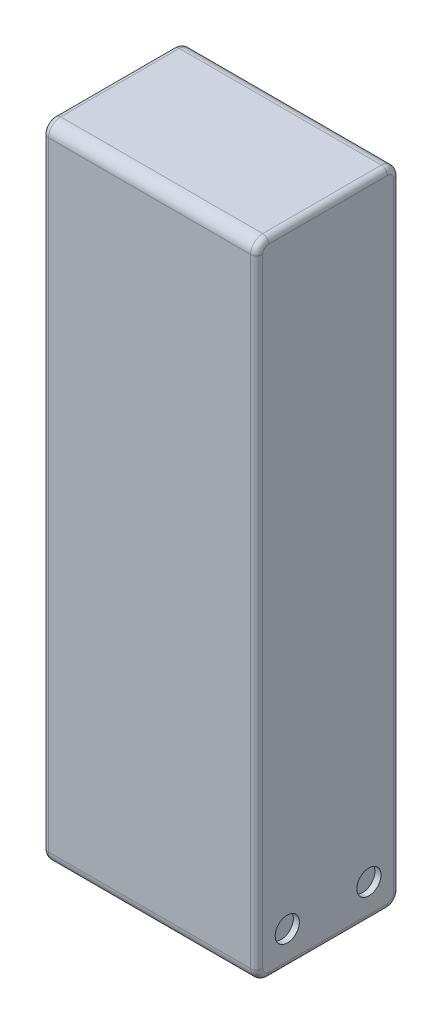
ISO-10303-21;
HEADER;
FILE_DESCRIPTION(('STEP AP214'),'2;1');
FILE_NAME('part.step','',(''),(''),'','','');
FILE_SCHEMA(('AUTOMOTIVE_DESIGN { 1 0 10303 214 1 1 1 1 }'));
ENDSEC;
DATA;
#1=APPLICATION_CONTEXT('core data for automotive mechanical design processes');
#2=APPLICATION_PROTOCOL_DEFINITION('international standard','automotive_design',2000,#1);
#3=PRODUCT_CONTEXT('',#1,'mechanical');
#4=PRODUCT('Part','Part','',(#3));
#5=PRODUCT_RELATED_PRODUCT_CATEGORY('part','',(#4));
#6=PRODUCT_DEFINITION_FORMATION('','',#4);
#7=PRODUCT_DEFINITION_CONTEXT('part definition',#1,'design');
#8=PRODUCT_DEFINITION('design','',#6,#7);
#9=PRODUCT_DEFINITION_SHAPE('','',#8);
#10=(LENGTH_UNIT() NAMED_UNIT(*) SI_UNIT(.MILLI.,.METRE.));
#11=(NAMED_UNIT(*) PLANE_ANGLE_UNIT() SI_UNIT($,.RADIAN.));
#12=(NAMED_UNIT(*) SI_UNIT($,.STERADIAN.) SOLID_ANGLE_UNIT());
#13=UNCERTAINTY_MEASURE_WITH_UNIT(LENGTH_MEASURE(1.E-05),#10,'distance_accuracy_value','');
#14=(GEOMETRIC_REPRESENTATION_CONTEXT(3) GLOBAL_UNCERTAINTY_ASSIGNED_CONTEXT((#13)) GLOBAL_UNIT_ASSIGNED_CONTEXT((#10,
#11,#12)) REPRESENTATION_CONTEXT('',''));
#15=CARTESIAN_POINT('',(0.,0.,0.));
#16=DIRECTION('',(0.,0.,1.));
#17=DIRECTION('',(1.,0.,0.));
#18=AXIS2_PLACEMENT_3D('',#15,#16,#17);
#19=CARTESIAN_POINT('',(22.5000000000002,67.5,15.));
#20=DIRECTION('',(-1.,0.,0.));
#21=DIRECTION('',(0.,0.,1.));
#22=AXIS2_PLACEMENT_3D('',#19,#20,#21);
#23=PLANE('',#22);
#24=CARTESIAN_POINT('',(22.5000000000002,-60.325,-8.57249999999999));
#25=DIRECTION('',(1.,0.,0.));
#26=DIRECTION('',(0.,0.,-1.));
#27=AXIS2_PLACEMENT_3D('',#24,#25,#26);
#28=CIRCLE('',#27,2.54000000000001);
#29=CARTESIAN_POINT('',(22.5000000000002,-60.325,-11.1125));
#30=VERTEX_POINT('',#29);
#31=EDGE_CURVE('E644',#30,#30,#28,.T.);
#32=ORIENTED_EDGE('',*,*,#31,.F.);
#33=EDGE_LOOP('',(#32));
#34=FACE_BOUND('',#33,.T.);
#35=CARTESIAN_POINT('',(22.5000000000002,-60.325,8.57250000000001));
#36=DIRECTION('',(1.,0.,0.));
#37=DIRECTION('',(0.,0.,-1.));
#38=AXIS2_PLACEMENT_3D('',#35,#36,#37);
#39=CIRCLE('',#38,2.54000000000001);
#40=CARTESIAN_POINT('',(22.5000000000002,-60.325,6.0325));
#41=VERTEX_POINT('',#40);
#42=EDGE_CURVE('E651',#41,#41,#39,.T.);
#43=ORIENTED_EDGE('',*,*,#42,.F.);
#44=EDGE_LOOP('',(#43));
#45=FACE_BOUND('',#44,.T.);
#46=DIRECTION('',(0.,-1.,0.));
#47=VECTOR('',#46,1.);
#48=CARTESIAN_POINT('',(22.5000000000002,67.5,-13.73));
#49=LINE('',#48,#47);
#50=CARTESIAN_POINT('',(22.5000000000002,-64.96,-13.73));
#51=VERTEX_POINT('',#50);
#52=CARTESIAN_POINT('',(22.5000000000002,64.96,-13.73));
#53=VERTEX_POINT('',#52);
#54=EDGE_CURVE('E211',#51,#53,#49,.F.);
#55=ORIENTED_EDGE('',*,*,#54,.T.);
#56=CARTESIAN_POINT('',(22.5000000000002,64.96,-12.46));
#57=DIRECTION('',(-1.,0.,0.));
#58=DIRECTION('',(0.,0.,1.));
#59=AXIS2_PLACEMENT_3D('',#56,#57,#58);
#60=CIRCLE('',#59,1.27);
#61=CARTESIAN_POINT('',(22.5000000000002,66.23,-12.46));
#62=VERTEX_POINT('',#61);
#63=EDGE_CURVE('E224',#53,#62,#60,.F.);
#64=ORIENTED_EDGE('',*,*,#63,.T.);
#65=DIRECTION('',(0.,0.,-1.));
#66=VECTOR('',#65,1.);
#67=CARTESIAN_POINT('',(22.5000000000002,66.23,15.));
#68=LINE('',#67,#66);
#69=CARTESIAN_POINT('',(22.5000000000002,66.23,12.46));
#70=VERTEX_POINT('',#69);
#71=EDGE_CURVE('E60',#62,#70,#68,.F.);
#72=ORIENTED_EDGE('',*,*,#71,.T.);
#73=CARTESIAN_POINT('',(22.5000000000002,64.96,12.46));
#74=DIRECTION('',(-1.,0.,0.));
#75=DIRECTION('',(0.,0.,1.));
#76=AXIS2_PLACEMENT_3D('',#73,#74,#75);
#77=CIRCLE('',#76,1.27);
#78=CARTESIAN_POINT('',(22.5000000000002,64.96,13.73));
#79=VERTEX_POINT('',#78);
#80=EDGE_CURVE('E221',#70,#79,#77,.F.);
#81=ORIENTED_EDGE('',*,*,#80,.T.);
#82=DIRECTION('',(0.,-1.,0.));
#83=VECTOR('',#82,1.);
#84=CARTESIAN_POINT('',(22.5000000000002,67.5,13.73));
#85=LINE('',#84,#83);
#86=CARTESIAN_POINT('',(22.5000000000002,-64.96,13.73));
#87=VERTEX_POINT('',#86);
#88=EDGE_CURVE('E219',#79,#87,#85,.T.);
#89=ORIENTED_EDGE('',*,*,#88,.T.);
#90=CARTESIAN_POINT('',(22.5000000000002,-64.96,12.46));
#91=DIRECTION('',(-1.,0.,0.));
#92=DIRECTION('',(0.,0.,1.));
#93=AXIS2_PLACEMENT_3D('',#90,#91,#92);
#94=CIRCLE('',#93,1.27);
#95=CARTESIAN_POINT('',(22.5000000000002,-66.23,12.46));
#96=VERTEX_POINT('',#95);
#97=EDGE_CURVE('E217',#87,#96,#94,.F.);
#98=ORIENTED_EDGE('',*,*,#97,.T.);
#99=DIRECTION('',(0.,0.,-1.));
#100=VECTOR('',#99,1.);
#101=CARTESIAN_POINT('',(22.5000000000002,-66.23,-12.46));
#102=LINE('',#101,#100);
#103=CARTESIAN_POINT('',(22.5000000000002,-66.23,-12.46));
#104=VERTEX_POINT('',#103);
#105=EDGE_CURVE('E215',#96,#104,#102,.T.);
#106=ORIENTED_EDGE('',*,*,#105,.T.);
#107=CARTESIAN_POINT('',(22.5000000000002,-64.96,-12.46));
#108=DIRECTION('',(-1.,0.,0.));
#109=DIRECTION('',(0.,0.,1.));
#110=AXIS2_PLACEMENT_3D('',#107,#108,#109);
#111=CIRCLE('',#110,1.27);
#112=EDGE_CURVE('E213',#104,#51,#111,.F.);
#113=ORIENTED_EDGE('',*,*,#112,.T.);
#114=EDGE_LOOP('',(#55,#64,#72,#81,#89,#98,#106,#113));
#115=FACE_BOUND('',#114,.T.);
#116=ADVANCED_FACE('F36',(#34,#45,#115),#23,.F.);
#117=CARTESIAN_POINT('',(-22.5,67.5,-15.));
#118=DIRECTION('',(0.,0.,1.));
#119=DIRECTION('',(1.,0.,0.));
#120=AXIS2_PLACEMENT_3D('',#117,#118,#119);
#121=PLANE('',#120);
#122=DIRECTION('',(-1.,0.,0.));
#123=VECTOR('',#122,1.);
#124=CARTESIAN_POINT('',(-22.5,-64.96,-15.));
#125=LINE('',#124,#123);
#126=CARTESIAN_POINT('',(21.2300000000002,-64.96,-15.));
#127=VERTEX_POINT('',#126);
#128=CARTESIAN_POINT('',(-21.23,-64.96,-15.));
#129=VERTEX_POINT('',#128);
#130=EDGE_CURVE('E301',#127,#129,#125,.T.);
#131=ORIENTED_EDGE('',*,*,#130,.T.);
#132=DIRECTION('',(0.,-1.,0.));
#133=VECTOR('',#132,1.);
#134=CARTESIAN_POINT('',(-21.23,67.5,-15.));
#135=LINE('',#134,#133);
#136=CARTESIAN_POINT('',(-21.23,64.96,-15.));
#137=VERTEX_POINT('',#136);
#138=EDGE_CURVE('E11',#129,#137,#135,.F.);
#139=ORIENTED_EDGE('',*,*,#138,.T.);
#140=DIRECTION('',(-1.,0.,0.));
#141=VECTOR('',#140,1.);
#142=CARTESIAN_POINT('',(-22.5,64.96,-15.));
#143=LINE('',#142,#141);
#144=CARTESIAN_POINT('',(21.2300000000002,64.96,-15.));
#145=VERTEX_POINT('',#144);
#146=EDGE_CURVE('E298',#137,#145,#143,.F.);
#147=ORIENTED_EDGE('',*,*,#146,.T.);
#148=DIRECTION('',(0.,-1.,0.));
#149=VECTOR('',#148,1.);
#150=CARTESIAN_POINT('',(21.2300000000002,67.5,-15.));
#151=LINE('',#150,#149);
#152=EDGE_CURVE('E45',#145,#127,#151,.T.);
#153=ORIENTED_EDGE('',*,*,#152,.T.);
#154=EDGE_LOOP('',(#131,#139,#147,#153));
#155=FACE_BOUND('',#154,.T.);
#156=ADVANCED_FACE('F345',(#155),#121,.F.);
#157=CARTESIAN_POINT('',(-22.5,67.5,15.));
#158=DIRECTION('',(1.,0.,0.));
#159=DIRECTION('',(0.,0.,-1.));
#160=AXIS2_PLACEMENT_3D('',#157,#158,#159);
#161=PLANE('',#160);
#162=DIRECTION('',(0.,0.,1.));
#163=VECTOR('',#162,1.);
#164=CARTESIAN_POINT('',(-22.5,66.23,15.));
#165=LINE('',#164,#163);
#166=CARTESIAN_POINT('',(-22.5,66.23,12.46));
#167=VERTEX_POINT('',#166);
#168=CARTESIAN_POINT('',(-22.5,66.23,-12.46));
#169=VERTEX_POINT('',#168);
#170=EDGE_CURVE('E176',#167,#169,#165,.F.);
#171=ORIENTED_EDGE('',*,*,#170,.T.);
#172=CARTESIAN_POINT('',(-22.5,64.96,-12.46));
#173=DIRECTION('',(1.,0.,0.));
#174=DIRECTION('',(0.,0.,-1.));
#175=AXIS2_PLACEMENT_3D('',#172,#173,#174);
#176=CIRCLE('',#175,1.27);
#177=CARTESIAN_POINT('',(-22.5,64.96,-13.73));
#178=VERTEX_POINT('',#177);
#179=EDGE_CURVE('E157',#169,#178,#176,.F.);
#180=ORIENTED_EDGE('',*,*,#179,.T.);
#181=DIRECTION('',(0.,-1.,0.));
#182=VECTOR('',#181,1.);
#183=CARTESIAN_POINT('',(-22.5,67.5,-13.73));
#184=LINE('',#183,#182);
#185=CARTESIAN_POINT('',(-22.5,-64.96,-13.73));
#186=VERTEX_POINT('',#185);
#187=EDGE_CURVE('E165',#178,#186,#184,.T.);
#188=ORIENTED_EDGE('',*,*,#187,.T.);
#189=CARTESIAN_POINT('',(-22.5,-64.96,-12.46));
#190=DIRECTION('',(1.,0.,0.));
#191=DIRECTION('',(0.,0.,-1.));
#192=AXIS2_PLACEMENT_3D('',#189,#190,#191);
#193=CIRCLE('',#192,1.27);
#194=CARTESIAN_POINT('',(-22.5,-66.23,-12.46));
#195=VERTEX_POINT('',#194);
#196=EDGE_CURVE('E171',#186,#195,#193,.F.);
#197=ORIENTED_EDGE('',*,*,#196,.T.);
#198=DIRECTION('',(0.,0.,1.));
#199=VECTOR('',#198,1.);
#200=CARTESIAN_POINT('',(-22.5,-66.23,12.46));
#201=LINE('',#200,#199);
#202=CARTESIAN_POINT('',(-22.5,-66.23,12.46));
#203=VERTEX_POINT('',#202);
#204=EDGE_CURVE('E310',#195,#203,#201,.T.);
#205=ORIENTED_EDGE('',*,*,#204,.T.);
#206=CARTESIAN_POINT('',(-22.5,-64.96,12.46));
#207=DIRECTION('',(1.,0.,0.));
#208=DIRECTION('',(0.,0.,-1.));
#209=AXIS2_PLACEMENT_3D('',#206,#207,#208);
#210=CIRCLE('',#209,1.27);
#211=CARTESIAN_POINT('',(-22.5,-64.96,13.73));
#212=VERTEX_POINT('',#211);
#213=EDGE_CURVE('E312',#203,#212,#210,.F.);
#214=ORIENTED_EDGE('',*,*,#213,.T.);
#215=DIRECTION('',(0.,-1.,0.));
#216=VECTOR('',#215,1.);
#217=CARTESIAN_POINT('',(-22.5,67.5,13.73));
#218=LINE('',#217,#216);
#219=CARTESIAN_POINT('',(-22.5,64.96,13.73));
#220=VERTEX_POINT('',#219);
#221=EDGE_CURVE('E314',#212,#220,#218,.F.);
#222=ORIENTED_EDGE('',*,*,#221,.T.);
#223=CARTESIAN_POINT('',(-22.5,64.96,12.46));
#224=DIRECTION('',(1.,0.,0.));
#225=DIRECTION('',(0.,0.,-1.));
#226=AXIS2_PLACEMENT_3D('',#223,#224,#225);
#227=CIRCLE('',#226,1.27);
#228=EDGE_CURVE('E182',#220,#167,#227,.F.);
#229=ORIENTED_EDGE('',*,*,#228,.T.);
#230=EDGE_LOOP('',(#171,#180,#188,#197,#205,#214,#222,#229));
#231=FACE_BOUND('',#230,.T.);
#232=ADVANCED_FACE('F174',(#231),#161,.F.);
#233=CARTESIAN_POINT('',(-22.5,67.5,15.));
#234=DIRECTION('',(0.,0.,-1.));
#235=DIRECTION('',(-1.,0.,0.));
#236=AXIS2_PLACEMENT_3D('',#233,#234,#235);
#237=PLANE('',#236);
#238=DIRECTION('',(1.,0.,0.));
#239=VECTOR('',#238,1.);
#240=CARTESIAN_POINT('',(-22.5,64.96,15.));
#241=LINE('',#240,#239);
#242=CARTESIAN_POINT('',(21.2300000000002,64.96,15.));
#243=VERTEX_POINT('',#242);
#244=CARTESIAN_POINT('',(-21.23,64.96,15.));
#245=VERTEX_POINT('',#244);
#246=EDGE_CURVE('E244',#243,#245,#241,.F.);
#247=ORIENTED_EDGE('',*,*,#246,.T.);
#248=DIRECTION('',(0.,-1.,0.));
#249=VECTOR('',#248,1.);
#250=CARTESIAN_POINT('',(-21.23,67.5,15.));
#251=LINE('',#250,#249);
#252=CARTESIAN_POINT('',(-21.23,-64.96,15.));
#253=VERTEX_POINT('',#252);
#254=EDGE_CURVE('E197',#245,#253,#251,.T.);
#255=ORIENTED_EDGE('',*,*,#254,.T.);
#256=DIRECTION('',(1.,0.,0.));
#257=VECTOR('',#256,1.);
#258=CARTESIAN_POINT('',(22.5000000000002,-64.96,15.));
#259=LINE('',#258,#257);
#260=CARTESIAN_POINT('',(21.2300000000002,-64.96,15.));
#261=VERTEX_POINT('',#260);
#262=EDGE_CURVE('E281',#253,#261,#259,.T.);
#263=ORIENTED_EDGE('',*,*,#262,.T.);
#264=DIRECTION('',(0.,-1.,0.));
#265=VECTOR('',#264,1.);
#266=CARTESIAN_POINT('',(21.2300000000002,67.5,15.));
#267=LINE('',#266,#265);
#268=EDGE_CURVE('E195',#261,#243,#267,.F.);
#269=ORIENTED_EDGE('',*,*,#268,.T.);
#270=EDGE_LOOP('',(#247,#255,#263,#269));
#271=FACE_BOUND('',#270,.T.);
#272=ADVANCED_FACE('F287',(#271),#237,.F.);
#273=CARTESIAN_POINT('',(0.,67.5,0.));
#274=DIRECTION('',(0.,-1.,0.));
#275=DIRECTION('',(0.,0.,-1.));
#276=AXIS2_PLACEMENT_3D('',#273,#274,#275);
#277=PLANE('',#276);
#278=DIRECTION('',(-1.,0.,0.));
#279=VECTOR('',#278,1.);
#280=CARTESIAN_POINT('',(0.,67.5,-12.46));
#281=LINE('',#280,#279);
#282=CARTESIAN_POINT('',(21.2300000000002,67.5,-12.46));
#283=VERTEX_POINT('',#282);
#284=CARTESIAN_POINT('',(-21.23,67.5,-12.46));
#285=VERTEX_POINT('',#284);
#286=EDGE_CURVE('E304',#283,#285,#281,.T.);
#287=ORIENTED_EDGE('',*,*,#286,.T.);
#288=DIRECTION('',(0.,0.,1.));
#289=VECTOR('',#288,1.);
#290=CARTESIAN_POINT('',(-21.23,67.5,0.));
#291=LINE('',#290,#289);
#292=CARTESIAN_POINT('',(-21.23,67.5,12.46));
#293=VERTEX_POINT('',#292);
#294=EDGE_CURVE('E189',#285,#293,#291,.T.);
#295=ORIENTED_EDGE('',*,*,#294,.T.);
#296=DIRECTION('',(1.,0.,0.));
#297=VECTOR('',#296,1.);
#298=CARTESIAN_POINT('',(0.,67.5,12.46));
#299=LINE('',#298,#297);
#300=CARTESIAN_POINT('',(21.2300000000002,67.5,12.46));
#301=VERTEX_POINT('',#300);
#302=EDGE_CURVE('E172',#293,#301,#299,.T.);
#303=ORIENTED_EDGE('',*,*,#302,.T.);
#304=DIRECTION('',(0.,0.,-1.));
#305=VECTOR('',#304,1.);
#306=CARTESIAN_POINT('',(21.2300000000002,67.5,0.));
#307=LINE('',#306,#305);
#308=EDGE_CURVE('E187',#301,#283,#307,.T.);
#309=ORIENTED_EDGE('',*,*,#308,.T.);
#310=EDGE_LOOP('',(#287,#295,#303,#309));
#311=FACE_BOUND('',#310,.T.);
#312=ADVANCED_FACE('F331',(#311),#277,.F.);
#313=CARTESIAN_POINT('',(0.,-67.5,0.));
#314=DIRECTION('',(0.,-1.,0.));
#315=DIRECTION('',(0.,0.,-1.));
#316=AXIS2_PLACEMENT_3D('',#313,#314,#315);
#317=PLANE('',#316);
#318=DIRECTION('',(1.,0.,0.));
#319=VECTOR('',#318,1.);
#320=CARTESIAN_POINT('',(-22.5,-67.5,12.46));
#321=LINE('',#320,#319);
#322=CARTESIAN_POINT('',(21.2300000000002,-67.5,12.46));
#323=VERTEX_POINT('',#322);
#324=CARTESIAN_POINT('',(-21.23,-67.5,12.46));
#325=VERTEX_POINT('',#324);
#326=EDGE_CURVE('E284',#323,#325,#321,.F.);
#327=ORIENTED_EDGE('',*,*,#326,.T.);
#328=DIRECTION('',(0.,0.,1.));
#329=VECTOR('',#328,1.);
#330=CARTESIAN_POINT('',(-21.23,-67.5,-12.46));
#331=LINE('',#330,#329);
#332=CARTESIAN_POINT('',(-21.23,-67.5,-12.46));
#333=VERTEX_POINT('',#332);
#334=EDGE_CURVE('E205',#325,#333,#331,.F.);
#335=ORIENTED_EDGE('',*,*,#334,.T.);
#336=DIRECTION('',(-1.,0.,0.));
#337=VECTOR('',#336,1.);
#338=CARTESIAN_POINT('',(22.5000000000002,-67.5,-12.46));
#339=LINE('',#338,#337);
#340=CARTESIAN_POINT('',(21.2300000000002,-67.5,-12.46));
#341=VERTEX_POINT('',#340);
#342=EDGE_CURVE('E290',#333,#341,#339,.F.);
#343=ORIENTED_EDGE('',*,*,#342,.T.);
#344=DIRECTION('',(0.,0.,-1.));
#345=VECTOR('',#344,1.);
#346=CARTESIAN_POINT('',(21.2300000000002,-67.5,12.46));
#347=LINE('',#346,#345);
#348=EDGE_CURVE('E203',#341,#323,#347,.F.);
#349=ORIENTED_EDGE('',*,*,#348,.T.);
#350=EDGE_LOOP('',(#327,#335,#343,#349));
#351=FACE_BOUND('',#350,.T.);
#352=ADVANCED_FACE('F385',(#351),#317,.T.);
#353=CARTESIAN_POINT('',(-22.5,-64.96,12.46));
#354=DIRECTION('',(-1.,0.,0.));
#355=DIRECTION('',(0.,0.,1.));
#356=AXIS2_PLACEMENT_3D('',#353,#354,#355);
#357=CYLINDRICAL_SURFACE('',#356,2.54);
#358=ORIENTED_EDGE('',*,*,#262,.F.);
#359=CARTESIAN_POINT('',(-21.23,-64.96,12.46));
#360=DIRECTION('',(1.,0.,0.));
#361=DIRECTION('',(0.,0.,-1.));
#362=AXIS2_PLACEMENT_3D('',#359,#360,#361);
#363=CIRCLE('',#362,2.54);
#364=EDGE_CURVE('E201',#253,#325,#363,.T.);
#365=ORIENTED_EDGE('',*,*,#364,.T.);
#366=ORIENTED_EDGE('',*,*,#326,.F.);
#367=CARTESIAN_POINT('',(21.2300000000002,-64.96,12.46));
#368=DIRECTION('',(-1.,0.,0.));
#369=DIRECTION('',(0.,0.,1.));
#370=AXIS2_PLACEMENT_3D('',#367,#368,#369);
#371=CIRCLE('',#370,2.54);
#372=EDGE_CURVE('E199',#323,#261,#371,.T.);
#373=ORIENTED_EDGE('',*,*,#372,.T.);
#374=EDGE_LOOP('',(#358,#365,#366,#373));
#375=FACE_BOUND('',#374,.T.);
#376=ADVANCED_FACE('F280',(#375),#357,.T.);
#377=CARTESIAN_POINT('',(-22.5,-64.96,-12.46));
#378=DIRECTION('',(1.,0.,0.));
#379=DIRECTION('',(0.,0.,-1.));
#380=AXIS2_PLACEMENT_3D('',#377,#378,#379);
#381=CYLINDRICAL_SURFACE('',#380,2.54);
#382=ORIENTED_EDGE('',*,*,#342,.F.);
#383=CARTESIAN_POINT('',(-21.23,-64.96,-12.46));
#384=DIRECTION('',(1.,0.,0.));
#385=DIRECTION('',(0.,0.,-1.));
#386=AXIS2_PLACEMENT_3D('',#383,#384,#385);
#387=CIRCLE('',#386,2.54);
#388=EDGE_CURVE('E209',#333,#129,#387,.T.);
#389=ORIENTED_EDGE('',*,*,#388,.T.);
#390=ORIENTED_EDGE('',*,*,#130,.F.);
#391=CARTESIAN_POINT('',(21.2300000000002,-64.96,-12.46));
#392=DIRECTION('',(-1.,0.,0.));
#393=DIRECTION('',(0.,0.,1.));
#394=AXIS2_PLACEMENT_3D('',#391,#392,#393);
#395=CIRCLE('',#394,2.54);
#396=EDGE_CURVE('E207',#127,#341,#395,.T.);
#397=ORIENTED_EDGE('',*,*,#396,.T.);
#398=EDGE_LOOP('',(#382,#389,#390,#397));
#399=FACE_BOUND('',#398,.T.);
#400=ADVANCED_FACE('F384',(#399),#381,.T.);
#401=CARTESIAN_POINT('',(0.,64.96,12.46));
#402=DIRECTION('',(1.,0.,0.));
#403=DIRECTION('',(0.,0.,-1.));
#404=AXIS2_PLACEMENT_3D('',#401,#402,#403);
#405=CYLINDRICAL_SURFACE('',#404,2.54);
#406=ORIENTED_EDGE('',*,*,#302,.F.);
#407=CARTESIAN_POINT('',(-21.23,64.96,12.46));
#408=DIRECTION('',(1.,0.,0.));
#409=DIRECTION('',(0.,0.,-1.));
#410=AXIS2_PLACEMENT_3D('',#407,#408,#409);
#411=CIRCLE('',#410,2.54);
#412=EDGE_CURVE('E193',#293,#245,#411,.T.);
#413=ORIENTED_EDGE('',*,*,#412,.T.);
#414=ORIENTED_EDGE('',*,*,#246,.F.);
#415=CARTESIAN_POINT('',(21.2300000000002,64.96,12.46));
#416=DIRECTION('',(-1.,0.,0.));
#417=DIRECTION('',(0.,0.,1.));
#418=AXIS2_PLACEMENT_3D('',#415,#416,#417);
#419=CIRCLE('',#418,2.54);
#420=EDGE_CURVE('E191',#243,#301,#419,.T.);
#421=ORIENTED_EDGE('',*,*,#420,.T.);
#422=EDGE_LOOP('',(#406,#413,#414,#421));
#423=FACE_BOUND('',#422,.T.);
#424=ADVANCED_FACE('F388',(#423),#405,.T.);
#425=CARTESIAN_POINT('',(0.,64.96,-12.46));
#426=DIRECTION('',(-1.,0.,0.));
#427=DIRECTION('',(0.,0.,1.));
#428=AXIS2_PLACEMENT_3D('',#425,#426,#427);
#429=CYLINDRICAL_SURFACE('',#428,2.54);
#430=ORIENTED_EDGE('',*,*,#146,.F.);
#431=CARTESIAN_POINT('',(-21.23,64.96,-12.46));
#432=DIRECTION('',(1.,0.,0.));
#433=DIRECTION('',(0.,0.,-1.));
#434=AXIS2_PLACEMENT_3D('',#431,#432,#433);
#435=CIRCLE('',#434,2.54);
#436=EDGE_CURVE('E159',#137,#285,#435,.T.);
#437=ORIENTED_EDGE('',*,*,#436,.T.);
#438=ORIENTED_EDGE('',*,*,#286,.F.);
#439=CARTESIAN_POINT('',(21.2300000000002,64.96,-12.46));
#440=DIRECTION('',(-1.,0.,0.));
#441=DIRECTION('',(0.,0.,1.));
#442=AXIS2_PLACEMENT_3D('',#439,#440,#441);
#443=CIRCLE('',#442,2.54);
#444=EDGE_CURVE('E178',#283,#145,#443,.T.);
#445=ORIENTED_EDGE('',*,*,#444,.T.);
#446=EDGE_LOOP('',(#430,#437,#438,#445));
#447=FACE_BOUND('',#446,.T.);
#448=ADVANCED_FACE('F330',(#447),#429,.T.);
#449=CARTESIAN_POINT('',(-21.23,-64.96,12.46));
#450=DIRECTION('',(1.,0.,0.));
#451=DIRECTION('',(0.,0.,-1.));
#452=AXIS2_PLACEMENT_3D('',#449,#450,#451);
#453=DEGENERATE_TOROIDAL_SURFACE('',#452,1.27,1.27,.T.);
#454=CARTESIAN_POINT('',(-21.23,-66.23,12.46));
#455=DIRECTION('',(0.,0.,-1.));
#456=DIRECTION('',(-1.,0.,0.));
#457=AXIS2_PLACEMENT_3D('',#454,#455,#456);
#458=CIRCLE('',#457,1.27);
#459=EDGE_CURVE('E238',#325,#203,#458,.T.);
#460=ORIENTED_EDGE('',*,*,#459,.F.);
#461=ORIENTED_EDGE('',*,*,#364,.F.);
#462=CARTESIAN_POINT('',(-21.23,-64.96,13.73));
#463=DIRECTION('',(0.,1.,0.));
#464=DIRECTION('',(0.,0.,1.));
#465=AXIS2_PLACEMENT_3D('',#462,#463,#464);
#466=CIRCLE('',#465,1.27);
#467=EDGE_CURVE('E241',#212,#253,#466,.T.);
#468=ORIENTED_EDGE('',*,*,#467,.F.);
#469=ORIENTED_EDGE('',*,*,#213,.F.);
#470=EDGE_LOOP('',(#460,#461,#468,#469));
#471=FACE_BOUND('',#470,.T.);
#472=ADVANCED_FACE('F359',(#471),#453,.T.);
#473=CARTESIAN_POINT('',(-21.23,67.5,13.73));
#474=DIRECTION('',(0.,-1.,0.));
#475=DIRECTION('',(0.,0.,-1.));
#476=AXIS2_PLACEMENT_3D('',#473,#474,#475);
#477=CYLINDRICAL_SURFACE('',#476,1.27);
#478=ORIENTED_EDGE('',*,*,#467,.T.);
#479=ORIENTED_EDGE('',*,*,#254,.F.);
#480=CARTESIAN_POINT('',(-21.23,64.96,13.73));
#481=DIRECTION('',(0.,1.,0.));
#482=DIRECTION('',(0.,0.,1.));
#483=AXIS2_PLACEMENT_3D('',#480,#481,#482);
#484=CIRCLE('',#483,1.27);
#485=EDGE_CURVE('E235',#220,#245,#484,.T.);
#486=ORIENTED_EDGE('',*,*,#485,.F.);
#487=ORIENTED_EDGE('',*,*,#221,.F.);
#488=EDGE_LOOP('',(#478,#479,#486,#487));
#489=FACE_BOUND('',#488,.T.);
#490=ADVANCED_FACE('F362',(#489),#477,.T.);
#491=CARTESIAN_POINT('',(-21.23,-66.23,15.));
#492=DIRECTION('',(0.,0.,-1.));
#493=DIRECTION('',(-1.,0.,0.));
#494=AXIS2_PLACEMENT_3D('',#491,#492,#493);
#495=CYLINDRICAL_SURFACE('',#494,1.27);
#496=ORIENTED_EDGE('',*,*,#459,.T.);
#497=ORIENTED_EDGE('',*,*,#204,.F.);
#498=CARTESIAN_POINT('',(-21.23,-66.23,-12.46));
#499=DIRECTION('',(0.,0.,-1.));
#500=DIRECTION('',(-1.,0.,0.));
#501=AXIS2_PLACEMENT_3D('',#498,#499,#500);
#502=CIRCLE('',#501,1.27);
#503=EDGE_CURVE('E232',#333,#195,#502,.T.);
#504=ORIENTED_EDGE('',*,*,#503,.F.);
#505=ORIENTED_EDGE('',*,*,#334,.F.);
#506=EDGE_LOOP('',(#496,#497,#504,#505));
#507=FACE_BOUND('',#506,.T.);
#508=ADVANCED_FACE('F355',(#507),#495,.T.);
#509=CARTESIAN_POINT('',(-21.23,64.96,12.46));
#510=DIRECTION('',(1.,0.,0.));
#511=DIRECTION('',(0.,0.,-1.));
#512=AXIS2_PLACEMENT_3D('',#509,#510,#511);
#513=DEGENERATE_TOROIDAL_SURFACE('',#512,1.27,1.27,.T.);
#514=ORIENTED_EDGE('',*,*,#485,.T.);
#515=ORIENTED_EDGE('',*,*,#412,.F.);
#516=CARTESIAN_POINT('',(-21.23,66.23,12.46));
#517=DIRECTION('',(0.,0.,-1.));
#518=DIRECTION('',(-1.,0.,0.));
#519=AXIS2_PLACEMENT_3D('',#516,#517,#518);
#520=CIRCLE('',#519,1.27);
#521=EDGE_CURVE('E229',#167,#293,#520,.T.);
#522=ORIENTED_EDGE('',*,*,#521,.F.);
#523=ORIENTED_EDGE('',*,*,#228,.F.);
#524=EDGE_LOOP('',(#514,#515,#522,#523));
#525=FACE_BOUND('',#524,.T.);
#526=ADVANCED_FACE('F321',(#525),#513,.T.);
#527=CARTESIAN_POINT('',(-21.23,-64.96,-12.46));
#528=DIRECTION('',(1.,0.,0.));
#529=DIRECTION('',(0.,0.,-1.));
#530=AXIS2_PLACEMENT_3D('',#527,#528,#529);
#531=DEGENERATE_TOROIDAL_SURFACE('',#530,1.27,1.27,.T.);
#532=ORIENTED_EDGE('',*,*,#503,.T.);
#533=ORIENTED_EDGE('',*,*,#196,.F.);
#534=CARTESIAN_POINT('',(-21.23,-64.96,-13.73));
#535=DIRECTION('',(0.,1.,0.));
#536=DIRECTION('',(0.,0.,1.));
#537=AXIS2_PLACEMENT_3D('',#534,#535,#536);
#538=CIRCLE('',#537,1.27);
#539=EDGE_CURVE('E168',#129,#186,#538,.T.);
#540=ORIENTED_EDGE('',*,*,#539,.F.);
#541=ORIENTED_EDGE('',*,*,#388,.F.);
#542=EDGE_LOOP('',(#532,#533,#540,#541));
#543=FACE_BOUND('',#542,.T.);
#544=ADVANCED_FACE('F350',(#543),#531,.T.);
#545=CARTESIAN_POINT('',(-21.23,66.23,0.));
#546=DIRECTION('',(0.,0.,1.));
#547=DIRECTION('',(1.,0.,0.));
#548=AXIS2_PLACEMENT_3D('',#545,#546,#547);
#549=CYLINDRICAL_SURFACE('',#548,1.27);
#550=ORIENTED_EDGE('',*,*,#521,.T.);
#551=ORIENTED_EDGE('',*,*,#294,.F.);
#552=CARTESIAN_POINT('',(-21.23,66.23,-12.46));
#553=DIRECTION('',(0.,0.,-1.));
#554=DIRECTION('',(-1.,0.,0.));
#555=AXIS2_PLACEMENT_3D('',#552,#553,#554);
#556=CIRCLE('',#555,1.27);
#557=EDGE_CURVE('E162',#169,#285,#556,.T.);
#558=ORIENTED_EDGE('',*,*,#557,.F.);
#559=ORIENTED_EDGE('',*,*,#170,.F.);
#560=EDGE_LOOP('',(#550,#551,#558,#559));
#561=FACE_BOUND('',#560,.T.);
#562=ADVANCED_FACE('F324',(#561),#549,.T.);
#563=CARTESIAN_POINT('',(-21.23,67.5,-13.73));
#564=DIRECTION('',(0.,-1.,0.));
#565=DIRECTION('',(0.,0.,-1.));
#566=AXIS2_PLACEMENT_3D('',#563,#564,#565);
#567=CYLINDRICAL_SURFACE('',#566,1.27);
#568=ORIENTED_EDGE('',*,*,#539,.T.);
#569=ORIENTED_EDGE('',*,*,#187,.F.);
#570=CARTESIAN_POINT('',(-21.23,64.96,-13.73));
#571=DIRECTION('',(0.,1.,0.));
#572=DIRECTION('',(0.,0.,1.));
#573=AXIS2_PLACEMENT_3D('',#570,#571,#572);
#574=CIRCLE('',#573,1.27);
#575=EDGE_CURVE('E153',#137,#178,#574,.T.);
#576=ORIENTED_EDGE('',*,*,#575,.F.);
#577=ORIENTED_EDGE('',*,*,#138,.F.);
#578=EDGE_LOOP('',(#568,#569,#576,#577));
#579=FACE_BOUND('',#578,.T.);
#580=ADVANCED_FACE('F166',(#579),#567,.T.);
#581=CARTESIAN_POINT('',(-21.23,64.96,-12.46));
#582=DIRECTION('',(1.,0.,0.));
#583=DIRECTION('',(0.,0.,-1.));
#584=AXIS2_PLACEMENT_3D('',#581,#582,#583);
#585=DEGENERATE_TOROIDAL_SURFACE('',#584,1.27,1.27,.T.);
#586=ORIENTED_EDGE('',*,*,#557,.T.);
#587=ORIENTED_EDGE('',*,*,#436,.F.);
#588=ORIENTED_EDGE('',*,*,#575,.T.);
#589=ORIENTED_EDGE('',*,*,#179,.F.);
#590=EDGE_LOOP('',(#586,#587,#588,#589));
#591=FACE_BOUND('',#590,.T.);
#592=ADVANCED_FACE('F155',(#591),#585,.T.);
#593=CARTESIAN_POINT('',(21.2300000000002,-64.96,12.46));
#594=DIRECTION('',(-1.,0.,0.));
#595=DIRECTION('',(0.,0.,1.));
#596=AXIS2_PLACEMENT_3D('',#593,#594,#595);
#597=DEGENERATE_TOROIDAL_SURFACE('',#596,1.27,1.27,.T.);
#598=CARTESIAN_POINT('',(21.2300000000002,-64.96,13.73));
#599=DIRECTION('',(0.,1.,0.));
#600=DIRECTION('',(0.,0.,1.));
#601=AXIS2_PLACEMENT_3D('',#598,#599,#600);
#602=CIRCLE('',#601,1.27);
#603=EDGE_CURVE('E260',#261,#87,#602,.T.);
#604=ORIENTED_EDGE('',*,*,#603,.F.);
#605=ORIENTED_EDGE('',*,*,#372,.F.);
#606=CARTESIAN_POINT('',(21.2300000000002,-66.23,12.46));
#607=DIRECTION('',(0.,0.,-1.));
#608=DIRECTION('',(-1.,0.,0.));
#609=AXIS2_PLACEMENT_3D('',#606,#607,#608);
#610=CIRCLE('',#609,1.27);
#611=EDGE_CURVE('E40',#96,#323,#610,.T.);
#612=ORIENTED_EDGE('',*,*,#611,.F.);
#613=ORIENTED_EDGE('',*,*,#97,.F.);
#614=EDGE_LOOP('',(#604,#605,#612,#613));
#615=FACE_BOUND('',#614,.T.);
#616=ADVANCED_FACE('F38',(#615),#597,.T.);
#617=CARTESIAN_POINT('',(21.2300000000002,-66.23,15.));
#618=DIRECTION('',(0.,0.,1.));
#619=DIRECTION('',(1.,0.,0.));
#620=AXIS2_PLACEMENT_3D('',#617,#618,#619);
#621=CYLINDRICAL_SURFACE('',#620,1.27);
#622=ORIENTED_EDGE('',*,*,#611,.T.);
#623=ORIENTED_EDGE('',*,*,#348,.F.);
#624=CARTESIAN_POINT('',(21.2300000000002,-66.23,-12.46));
#625=DIRECTION('',(0.,0.,-1.));
#626=DIRECTION('',(-1.,0.,0.));
#627=AXIS2_PLACEMENT_3D('',#624,#625,#626);
#628=CIRCLE('',#627,1.27);
#629=EDGE_CURVE('E258',#104,#341,#628,.T.);
#630=ORIENTED_EDGE('',*,*,#629,.F.);
#631=ORIENTED_EDGE('',*,*,#105,.F.);
#632=EDGE_LOOP('',(#622,#623,#630,#631));
#633=FACE_BOUND('',#632,.T.);
#634=ADVANCED_FACE('F271',(#633),#621,.T.);
#635=CARTESIAN_POINT('',(21.2300000000002,67.5,13.73));
#636=DIRECTION('',(0.,-1.,0.));
#637=DIRECTION('',(0.,0.,-1.));
#638=AXIS2_PLACEMENT_3D('',#635,#636,#637);
#639=CYLINDRICAL_SURFACE('',#638,1.27);
#640=ORIENTED_EDGE('',*,*,#603,.T.);
#641=ORIENTED_EDGE('',*,*,#88,.F.);
#642=CARTESIAN_POINT('',(21.2300000000002,64.96,13.73));
#643=DIRECTION('',(0.,1.,0.));
#644=DIRECTION('',(0.,0.,1.));
#645=AXIS2_PLACEMENT_3D('',#642,#643,#644);
#646=CIRCLE('',#645,1.27);
#647=EDGE_CURVE('E255',#243,#79,#646,.T.);
#648=ORIENTED_EDGE('',*,*,#647,.F.);
#649=ORIENTED_EDGE('',*,*,#268,.F.);
#650=EDGE_LOOP('',(#640,#641,#648,#649));
#651=FACE_BOUND('',#650,.T.);
#652=ADVANCED_FACE('F434',(#651),#639,.T.);
#653=CARTESIAN_POINT('',(21.2300000000002,-64.96,-12.46));
#654=DIRECTION('',(-1.,0.,0.));
#655=DIRECTION('',(0.,0.,1.));
#656=AXIS2_PLACEMENT_3D('',#653,#654,#655);
#657=DEGENERATE_TOROIDAL_SURFACE('',#656,1.27,1.27,.T.);
#658=ORIENTED_EDGE('',*,*,#629,.T.);
#659=ORIENTED_EDGE('',*,*,#396,.F.);
#660=CARTESIAN_POINT('',(21.2300000000002,-64.96,-13.73));
#661=DIRECTION('',(0.,1.,0.));
#662=DIRECTION('',(0.,0.,1.));
#663=AXIS2_PLACEMENT_3D('',#660,#661,#662);
#664=CIRCLE('',#663,1.27);
#665=EDGE_CURVE('E252',#51,#127,#664,.T.);
#666=ORIENTED_EDGE('',*,*,#665,.F.);
#667=ORIENTED_EDGE('',*,*,#112,.F.);
#668=EDGE_LOOP('',(#658,#659,#666,#667));
#669=FACE_BOUND('',#668,.T.);
#670=ADVANCED_FACE('F440',(#669),#657,.T.);
#671=CARTESIAN_POINT('',(21.2300000000002,64.96,12.46));
#672=DIRECTION('',(-1.,0.,0.));
#673=DIRECTION('',(0.,0.,1.));
#674=AXIS2_PLACEMENT_3D('',#671,#672,#673);
#675=DEGENERATE_TOROIDAL_SURFACE('',#674,1.27,1.27,.T.);
#676=ORIENTED_EDGE('',*,*,#647,.T.);
#677=ORIENTED_EDGE('',*,*,#80,.F.);
#678=CARTESIAN_POINT('',(21.2300000000002,66.23,12.46));
#679=DIRECTION('',(0.,0.,-1.));
#680=DIRECTION('',(-1.,0.,0.));
#681=AXIS2_PLACEMENT_3D('',#678,#679,#680);
#682=CIRCLE('',#681,1.27);
#683=EDGE_CURVE('E249',#301,#70,#682,.T.);
#684=ORIENTED_EDGE('',*,*,#683,.F.);
#685=ORIENTED_EDGE('',*,*,#420,.F.);
#686=EDGE_LOOP('',(#676,#677,#684,#685));
#687=FACE_BOUND('',#686,.T.);
#688=ADVANCED_FACE('F447',(#687),#675,.T.);
#689=CARTESIAN_POINT('',(21.2300000000002,67.5,-13.73));
#690=DIRECTION('',(0.,-1.,0.));
#691=DIRECTION('',(0.,0.,-1.));
#692=AXIS2_PLACEMENT_3D('',#689,#690,#691);
#693=CYLINDRICAL_SURFACE('',#692,1.27);
#694=ORIENTED_EDGE('',*,*,#665,.T.);
#695=ORIENTED_EDGE('',*,*,#152,.F.);
#696=CARTESIAN_POINT('',(21.2300000000002,64.96,-13.73));
#697=DIRECTION('',(0.,1.,0.));
#698=DIRECTION('',(0.,0.,1.));
#699=AXIS2_PLACEMENT_3D('',#696,#697,#698);
#700=CIRCLE('',#699,1.27);
#701=EDGE_CURVE('E246',#53,#145,#700,.T.);
#702=ORIENTED_EDGE('',*,*,#701,.F.);
#703=ORIENTED_EDGE('',*,*,#54,.F.);
#704=EDGE_LOOP('',(#694,#695,#702,#703));
#705=FACE_BOUND('',#704,.T.);
#706=ADVANCED_FACE('F341',(#705),#693,.T.);
#707=CARTESIAN_POINT('',(21.2300000000002,66.23,0.));
#708=DIRECTION('',(0.,0.,-1.));
#709=DIRECTION('',(-1.,0.,0.));
#710=AXIS2_PLACEMENT_3D('',#707,#708,#709);
#711=CYLINDRICAL_SURFACE('',#710,1.27);
#712=ORIENTED_EDGE('',*,*,#683,.T.);
#713=ORIENTED_EDGE('',*,*,#71,.F.);
#714=CARTESIAN_POINT('',(21.2300000000002,66.23,-12.46));
#715=DIRECTION('',(0.,0.,-1.));
#716=DIRECTION('',(-1.,0.,0.));
#717=AXIS2_PLACEMENT_3D('',#714,#715,#716);
#718=CIRCLE('',#717,1.27);
#719=EDGE_CURVE('E53',#283,#62,#718,.T.);
#720=ORIENTED_EDGE('',*,*,#719,.F.);
#721=ORIENTED_EDGE('',*,*,#308,.F.);
#722=EDGE_LOOP('',(#712,#713,#720,#721));
#723=FACE_BOUND('',#722,.T.);
#724=ADVANCED_FACE('F335',(#723),#711,.T.);
#725=CARTESIAN_POINT('',(21.2300000000002,64.96,-12.46));
#726=DIRECTION('',(-1.,0.,0.));
#727=DIRECTION('',(0.,0.,1.));
#728=AXIS2_PLACEMENT_3D('',#725,#726,#727);
#729=DEGENERATE_TOROIDAL_SURFACE('',#728,1.27,1.27,.T.);
#730=ORIENTED_EDGE('',*,*,#701,.T.);
#731=ORIENTED_EDGE('',*,*,#444,.F.);
#732=ORIENTED_EDGE('',*,*,#719,.T.);
#733=ORIENTED_EDGE('',*,*,#63,.F.);
#734=EDGE_LOOP('',(#730,#731,#732,#733));
#735=FACE_BOUND('',#734,.T.);
#736=ADVANCED_FACE('F338',(#735),#729,.T.);
#737=CARTESIAN_POINT('',(21.2300000000002,-60.325,8.57250000000001));
#738=DIRECTION('',(1.,0.,0.));
#739=DIRECTION('',(0.,0.,-1.));
#740=AXIS2_PLACEMENT_3D('',#737,#738,#739);
#741=CYLINDRICAL_SURFACE('',#740,2.54000000000001);
#742=CARTESIAN_POINT('',(21.2300000000002,-60.325,8.57250000000001));
#743=DIRECTION('',(1.,0.,0.));
#744=DIRECTION('',(0.,0.,-1.));
#745=AXIS2_PLACEMENT_3D('',#742,#743,#744);
#746=CIRCLE('',#745,2.54000000000001);
#747=CARTESIAN_POINT('',(21.2300000000002,-60.325,6.0325));
#748=VERTEX_POINT('',#747);
#749=EDGE_CURVE('E647',#748,#748,#746,.T.);
#750=ORIENTED_EDGE('',*,*,#749,.F.);
#751=EDGE_LOOP('',(#750));
#752=FACE_BOUND('',#751,.T.);
#753=ORIENTED_EDGE('',*,*,#42,.T.);
#754=EDGE_LOOP('',(#753));
#755=FACE_BOUND('',#754,.T.);
#756=ADVANCED_FACE('F474',(#752,#755),#741,.F.);
#757=CARTESIAN_POINT('',(21.2300000000002,-60.325,8.57250000000001));
#758=DIRECTION('',(1.,0.,0.));
#759=DIRECTION('',(0.,0.,-1.));
#760=AXIS2_PLACEMENT_3D('',#757,#758,#759);
#761=PLANE('',#760);
#762=ORIENTED_EDGE('',*,*,#749,.T.);
#763=EDGE_LOOP('',(#762));
#764=FACE_BOUND('',#763,.T.);
#765=ADVANCED_FACE('F481',(#764),#761,.T.);
#766=CARTESIAN_POINT('',(21.2300000000002,-60.325,-8.57249999999999));
#767=DIRECTION('',(1.,0.,0.));
#768=DIRECTION('',(0.,0.,-1.));
#769=AXIS2_PLACEMENT_3D('',#766,#767,#768);
#770=CYLINDRICAL_SURFACE('',#769,2.54000000000001);
#771=CARTESIAN_POINT('',(21.2300000000002,-60.325,-8.57249999999999));
#772=DIRECTION('',(1.,0.,0.));
#773=DIRECTION('',(0.,0.,-1.));
#774=AXIS2_PLACEMENT_3D('',#771,#772,#773);
#775=CIRCLE('',#774,2.54000000000001);
#776=CARTESIAN_POINT('',(21.2300000000002,-60.325,-11.1125));
#777=VERTEX_POINT('',#776);
#778=EDGE_CURVE('E247',#777,#777,#775,.T.);
#779=ORIENTED_EDGE('',*,*,#778,.F.);
#780=EDGE_LOOP('',(#779));
#781=FACE_BOUND('',#780,.T.);
#782=ORIENTED_EDGE('',*,*,#31,.T.);
#783=EDGE_LOOP('',(#782));
#784=FACE_BOUND('',#783,.T.);
#785=ADVANCED_FACE('F489',(#781,#784),#770,.F.);
#786=CARTESIAN_POINT('',(21.2300000000002,-60.325,-8.57249999999999));
#787=DIRECTION('',(1.,0.,0.));
#788=DIRECTION('',(0.,0.,-1.));
#789=AXIS2_PLACEMENT_3D('',#786,#787,#788);
#790=PLANE('',#789);
#791=ORIENTED_EDGE('',*,*,#778,.T.);
#792=EDGE_LOOP('',(#791));
#793=FACE_BOUND('',#792,.T.);
#794=ADVANCED_FACE('F497',(#793),#790,.T.);
#795=CLOSED_SHELL('',(#116,#156,#232,#272,#312,#352,#376,#400,#424,#448,#472,#490,#508,#526,
#544,#562,#580,#592,#616,#634,#652,#670,#688,#706,#724,#736,#756,#765,#785,#794));
#796=MANIFOLD_SOLID_BREP('B2',#795);
#797=ADVANCED_BREP_SHAPE_REPRESENTATION('',(#18,#796),#14);
#798=SHAPE_DEFINITION_REPRESENTATION(#9,#797);
ENDSEC;
END-ISO-10303-21;
